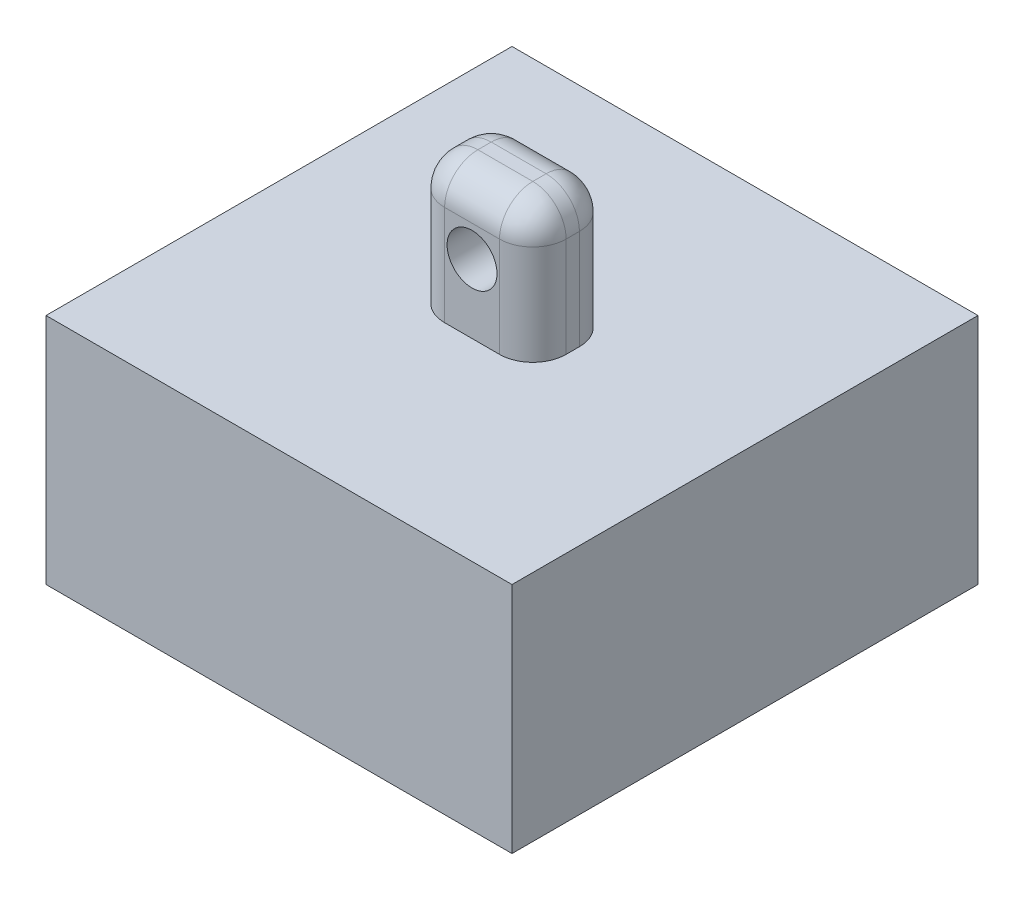
ISO-10303-21;
HEADER;
FILE_DESCRIPTION(('STEP AP214'),'2;1');
FILE_NAME('part.step','',(''),(''),'','','');
FILE_SCHEMA(('AUTOMOTIVE_DESIGN { 1 0 10303 214 1 1 1 1 }'));
ENDSEC;
DATA;
#1=APPLICATION_CONTEXT('core data for automotive mechanical design processes');
#2=APPLICATION_PROTOCOL_DEFINITION('international standard','automotive_design',2000,#1);
#3=PRODUCT_CONTEXT('',#1,'mechanical');
#4=PRODUCT('Part','Part','',(#3));
#5=PRODUCT_RELATED_PRODUCT_CATEGORY('part','',(#4));
#6=PRODUCT_DEFINITION_FORMATION('','',#4);
#7=PRODUCT_DEFINITION_CONTEXT('part definition',#1,'design');
#8=PRODUCT_DEFINITION('design','',#6,#7);
#9=PRODUCT_DEFINITION_SHAPE('','',#8);
#10=(LENGTH_UNIT() NAMED_UNIT(*) SI_UNIT(.MILLI.,.METRE.));
#11=(NAMED_UNIT(*) PLANE_ANGLE_UNIT() SI_UNIT($,.RADIAN.));
#12=(NAMED_UNIT(*) SI_UNIT($,.STERADIAN.) SOLID_ANGLE_UNIT());
#13=UNCERTAINTY_MEASURE_WITH_UNIT(LENGTH_MEASURE(1.E-05),#10,'distance_accuracy_value','');
#14=(GEOMETRIC_REPRESENTATION_CONTEXT(3) GLOBAL_UNCERTAINTY_ASSIGNED_CONTEXT((#13)) GLOBAL_UNIT_ASSIGNED_CONTEXT((#10,
#11,#12)) REPRESENTATION_CONTEXT('',''));
#15=CARTESIAN_POINT('',(0.,0.,0.));
#16=DIRECTION('',(0.,0.,1.));
#17=DIRECTION('',(1.,0.,0.));
#18=AXIS2_PLACEMENT_3D('',#15,#16,#17);
#19=CARTESIAN_POINT('',(0.,0.,0.));
#20=DIRECTION('',(0.,-1.,0.));
#21=DIRECTION('',(0.,0.,-1.));
#22=AXIS2_PLACEMENT_3D('',#19,#20,#21);
#23=PLANE('',#22);
#24=DIRECTION('',(0.,0.,-1.));
#25=VECTOR('',#24,1.);
#26=CARTESIAN_POINT('',(14.,0.,14.));
#27=LINE('',#26,#25);
#28=CARTESIAN_POINT('',(14.,0.,14.));
#29=VERTEX_POINT('',#28);
#30=CARTESIAN_POINT('',(14.,0.,-14.));
#31=VERTEX_POINT('',#30);
#32=EDGE_CURVE('E258',#29,#31,#27,.T.);
#33=ORIENTED_EDGE('',*,*,#32,.F.);
#34=DIRECTION('',(1.,0.,0.));
#35=VECTOR('',#34,1.);
#36=CARTESIAN_POINT('',(-14.,0.,14.));
#37=LINE('',#36,#35);
#38=CARTESIAN_POINT('',(-14.,0.,14.));
#39=VERTEX_POINT('',#38);
#40=EDGE_CURVE('E177',#39,#29,#37,.T.);
#41=ORIENTED_EDGE('',*,*,#40,.F.);
#42=DIRECTION('',(0.,0.,1.));
#43=VECTOR('',#42,1.);
#44=CARTESIAN_POINT('',(-14.,0.,14.));
#45=LINE('',#44,#43);
#46=CARTESIAN_POINT('',(-14.,0.,-14.));
#47=VERTEX_POINT('',#46);
#48=EDGE_CURVE('E264',#47,#39,#45,.T.);
#49=ORIENTED_EDGE('',*,*,#48,.F.);
#50=DIRECTION('',(-1.,0.,0.));
#51=VECTOR('',#50,1.);
#52=CARTESIAN_POINT('',(-14.,0.,-14.));
#53=LINE('',#52,#51);
#54=EDGE_CURVE('E261',#31,#47,#53,.T.);
#55=ORIENTED_EDGE('',*,*,#54,.F.);
#56=EDGE_LOOP('',(#33,#41,#49,#55));
#57=FACE_BOUND('',#56,.T.);
#58=DIRECTION('',(1.,0.,0.));
#59=VECTOR('',#58,1.);
#60=CARTESIAN_POINT('',(-10.5,0.,10.5));
#61=LINE('',#60,#59);
#62=CARTESIAN_POINT('',(-10.5,0.,10.5));
#63=VERTEX_POINT('',#62);
#64=CARTESIAN_POINT('',(10.5,0.,10.5));
#65=VERTEX_POINT('',#64);
#66=EDGE_CURVE('E218',#63,#65,#61,.T.);
#67=ORIENTED_EDGE('',*,*,#66,.T.);
#68=DIRECTION('',(0.,0.,-1.));
#69=VECTOR('',#68,1.);
#70=CARTESIAN_POINT('',(10.5,0.,10.5));
#71=LINE('',#70,#69);
#72=CARTESIAN_POINT('',(10.5,0.,-10.5));
#73=VERTEX_POINT('',#72);
#74=EDGE_CURVE('E212',#65,#73,#71,.T.);
#75=ORIENTED_EDGE('',*,*,#74,.T.);
#76=DIRECTION('',(-1.,0.,0.));
#77=VECTOR('',#76,1.);
#78=CARTESIAN_POINT('',(-10.5,0.,-10.5));
#79=LINE('',#78,#77);
#80=CARTESIAN_POINT('',(-10.5,0.,-10.5));
#81=VERTEX_POINT('',#80);
#82=EDGE_CURVE('E234',#73,#81,#79,.T.);
#83=ORIENTED_EDGE('',*,*,#82,.T.);
#84=DIRECTION('',(0.,0.,1.));
#85=VECTOR('',#84,1.);
#86=CARTESIAN_POINT('',(-10.5,0.,10.5));
#87=LINE('',#86,#85);
#88=EDGE_CURVE('E238',#81,#63,#87,.T.);
#89=ORIENTED_EDGE('',*,*,#88,.T.);
#90=EDGE_LOOP('',(#67,#75,#83,#89));
#91=FACE_BOUND('',#90,.T.);
#92=ADVANCED_FACE('F43',(#57,#91),#23,.T.);
#93=CARTESIAN_POINT('',(14.,11.,14.));
#94=DIRECTION('',(-1.,0.,0.));
#95=DIRECTION('',(0.,0.,1.));
#96=AXIS2_PLACEMENT_3D('',#93,#94,#95);
#97=PLANE('',#96);
#98=ORIENTED_EDGE('',*,*,#32,.T.);
#99=DIRECTION('',(0.,-1.,0.));
#100=VECTOR('',#99,1.);
#101=CARTESIAN_POINT('',(14.,11.,-14.));
#102=LINE('',#101,#100);
#103=CARTESIAN_POINT('',(14.,14.,-14.));
#104=VERTEX_POINT('',#103);
#105=EDGE_CURVE('E188',#104,#31,#102,.T.);
#106=ORIENTED_EDGE('',*,*,#105,.F.);
#107=DIRECTION('',(0.,0.,-1.));
#108=VECTOR('',#107,1.);
#109=CARTESIAN_POINT('',(14.,14.,14.));
#110=LINE('',#109,#108);
#111=CARTESIAN_POINT('',(14.,14.,14.));
#112=VERTEX_POINT('',#111);
#113=EDGE_CURVE('E185',#112,#104,#110,.T.);
#114=ORIENTED_EDGE('',*,*,#113,.F.);
#115=DIRECTION('',(0.,-1.,0.));
#116=VECTOR('',#115,1.);
#117=CARTESIAN_POINT('',(14.,11.,14.));
#118=LINE('',#117,#116);
#119=EDGE_CURVE('E170',#112,#29,#118,.T.);
#120=ORIENTED_EDGE('',*,*,#119,.T.);
#121=EDGE_LOOP('',(#98,#106,#114,#120));
#122=FACE_BOUND('',#121,.T.);
#123=ADVANCED_FACE('F186',(#122),#97,.F.);
#124=CARTESIAN_POINT('',(-14.,11.,-14.));
#125=DIRECTION('',(0.,0.,1.));
#126=DIRECTION('',(1.,0.,0.));
#127=AXIS2_PLACEMENT_3D('',#124,#125,#126);
#128=PLANE('',#127);
#129=ORIENTED_EDGE('',*,*,#54,.T.);
#130=DIRECTION('',(0.,-1.,0.));
#131=VECTOR('',#130,1.);
#132=CARTESIAN_POINT('',(-14.,11.,-14.));
#133=LINE('',#132,#131);
#134=CARTESIAN_POINT('',(-14.,14.,-14.));
#135=VERTEX_POINT('',#134);
#136=EDGE_CURVE('E271',#135,#47,#133,.T.);
#137=ORIENTED_EDGE('',*,*,#136,.F.);
#138=DIRECTION('',(-1.,0.,0.));
#139=VECTOR('',#138,1.);
#140=CARTESIAN_POINT('',(14.,14.,-14.));
#141=LINE('',#140,#139);
#142=EDGE_CURVE('E193',#104,#135,#141,.T.);
#143=ORIENTED_EDGE('',*,*,#142,.F.);
#144=ORIENTED_EDGE('',*,*,#105,.T.);
#145=EDGE_LOOP('',(#129,#137,#143,#144));
#146=FACE_BOUND('',#145,.T.);
#147=ADVANCED_FACE('F466',(#146),#128,.F.);
#148=CARTESIAN_POINT('',(-14.,11.,14.));
#149=DIRECTION('',(1.,0.,0.));
#150=DIRECTION('',(0.,0.,-1.));
#151=AXIS2_PLACEMENT_3D('',#148,#149,#150);
#152=PLANE('',#151);
#153=ORIENTED_EDGE('',*,*,#48,.T.);
#154=DIRECTION('',(0.,-1.,0.));
#155=VECTOR('',#154,1.);
#156=CARTESIAN_POINT('',(-14.,11.,14.));
#157=LINE('',#156,#155);
#158=CARTESIAN_POINT('',(-14.,14.,14.));
#159=VERTEX_POINT('',#158);
#160=EDGE_CURVE('E182',#159,#39,#157,.T.);
#161=ORIENTED_EDGE('',*,*,#160,.F.);
#162=DIRECTION('',(0.,0.,1.));
#163=VECTOR('',#162,1.);
#164=CARTESIAN_POINT('',(-14.,14.,-14.));
#165=LINE('',#164,#163);
#166=EDGE_CURVE('E198',#135,#159,#165,.T.);
#167=ORIENTED_EDGE('',*,*,#166,.F.);
#168=ORIENTED_EDGE('',*,*,#136,.T.);
#169=EDGE_LOOP('',(#153,#161,#167,#168));
#170=FACE_BOUND('',#169,.T.);
#171=ADVANCED_FACE('F475',(#170),#152,.F.);
#172=CARTESIAN_POINT('',(-14.,11.,14.));
#173=DIRECTION('',(0.,0.,-1.));
#174=DIRECTION('',(-1.,0.,0.));
#175=AXIS2_PLACEMENT_3D('',#172,#173,#174);
#176=PLANE('',#175);
#177=ORIENTED_EDGE('',*,*,#40,.T.);
#178=ORIENTED_EDGE('',*,*,#119,.F.);
#179=DIRECTION('',(1.,0.,0.));
#180=VECTOR('',#179,1.);
#181=CARTESIAN_POINT('',(-14.,14.,14.));
#182=LINE('',#181,#180);
#183=EDGE_CURVE('E175',#159,#112,#182,.T.);
#184=ORIENTED_EDGE('',*,*,#183,.F.);
#185=ORIENTED_EDGE('',*,*,#160,.T.);
#186=EDGE_LOOP('',(#177,#178,#184,#185));
#187=FACE_BOUND('',#186,.T.);
#188=ADVANCED_FACE('F172',(#187),#176,.F.);
#189=CARTESIAN_POINT('',(10.5,11.,10.5));
#190=DIRECTION('',(-1.,0.,0.));
#191=DIRECTION('',(0.,0.,1.));
#192=AXIS2_PLACEMENT_3D('',#189,#190,#191);
#193=PLANE('',#192);
#194=ORIENTED_EDGE('',*,*,#74,.F.);
#195=DIRECTION('',(0.,-1.,0.));
#196=VECTOR('',#195,1.);
#197=CARTESIAN_POINT('',(10.5,11.,10.5));
#198=LINE('',#197,#196);
#199=CARTESIAN_POINT('',(10.5,11.,10.5));
#200=VERTEX_POINT('',#199);
#201=EDGE_CURVE('E230',#200,#65,#198,.T.);
#202=ORIENTED_EDGE('',*,*,#201,.F.);
#203=DIRECTION('',(0.,0.,-1.));
#204=VECTOR('',#203,1.);
#205=CARTESIAN_POINT('',(10.5,11.,10.5));
#206=LINE('',#205,#204);
#207=CARTESIAN_POINT('',(10.5,11.,-10.5));
#208=VERTEX_POINT('',#207);
#209=EDGE_CURVE('E213',#200,#208,#206,.T.);
#210=ORIENTED_EDGE('',*,*,#209,.T.);
#211=DIRECTION('',(0.,-1.,0.));
#212=VECTOR('',#211,1.);
#213=CARTESIAN_POINT('',(10.5,11.,-10.5));
#214=LINE('',#213,#212);
#215=EDGE_CURVE('E254',#208,#73,#214,.T.);
#216=ORIENTED_EDGE('',*,*,#215,.T.);
#217=EDGE_LOOP('',(#194,#202,#210,#216));
#218=FACE_BOUND('',#217,.T.);
#219=ADVANCED_FACE('F471',(#218),#193,.T.);
#220=CARTESIAN_POINT('',(-10.5,11.,-10.5));
#221=DIRECTION('',(0.,0.,1.));
#222=DIRECTION('',(1.,0.,0.));
#223=AXIS2_PLACEMENT_3D('',#220,#221,#222);
#224=PLANE('',#223);
#225=ORIENTED_EDGE('',*,*,#82,.F.);
#226=ORIENTED_EDGE('',*,*,#215,.F.);
#227=DIRECTION('',(-1.,0.,0.));
#228=VECTOR('',#227,1.);
#229=CARTESIAN_POINT('',(-10.5,11.,-10.5));
#230=LINE('',#229,#228);
#231=CARTESIAN_POINT('',(-10.5,11.,-10.5));
#232=VERTEX_POINT('',#231);
#233=EDGE_CURVE('E217',#208,#232,#230,.T.);
#234=ORIENTED_EDGE('',*,*,#233,.T.);
#235=DIRECTION('',(0.,-1.,0.));
#236=VECTOR('',#235,1.);
#237=CARTESIAN_POINT('',(-10.5,11.,-10.5));
#238=LINE('',#237,#236);
#239=EDGE_CURVE('E251',#232,#81,#238,.T.);
#240=ORIENTED_EDGE('',*,*,#239,.T.);
#241=EDGE_LOOP('',(#225,#226,#234,#240));
#242=FACE_BOUND('',#241,.T.);
#243=ADVANCED_FACE('F500',(#242),#224,.T.);
#244=CARTESIAN_POINT('',(-10.5,11.,10.5));
#245=DIRECTION('',(1.,0.,0.));
#246=DIRECTION('',(0.,0.,-1.));
#247=AXIS2_PLACEMENT_3D('',#244,#245,#246);
#248=PLANE('',#247);
#249=ORIENTED_EDGE('',*,*,#88,.F.);
#250=ORIENTED_EDGE('',*,*,#239,.F.);
#251=DIRECTION('',(0.,0.,1.));
#252=VECTOR('',#251,1.);
#253=CARTESIAN_POINT('',(-10.5,11.,10.5));
#254=LINE('',#253,#252);
#255=CARTESIAN_POINT('',(-10.5,11.,10.5));
#256=VERTEX_POINT('',#255);
#257=EDGE_CURVE('E222',#232,#256,#254,.T.);
#258=ORIENTED_EDGE('',*,*,#257,.T.);
#259=DIRECTION('',(0.,-1.,0.));
#260=VECTOR('',#259,1.);
#261=CARTESIAN_POINT('',(-10.5,11.,10.5));
#262=LINE('',#261,#260);
#263=EDGE_CURVE('E248',#256,#63,#262,.T.);
#264=ORIENTED_EDGE('',*,*,#263,.T.);
#265=EDGE_LOOP('',(#249,#250,#258,#264));
#266=FACE_BOUND('',#265,.T.);
#267=ADVANCED_FACE('F507',(#266),#248,.T.);
#268=CARTESIAN_POINT('',(-10.5,11.,10.5));
#269=DIRECTION('',(0.,0.,-1.));
#270=DIRECTION('',(-1.,0.,0.));
#271=AXIS2_PLACEMENT_3D('',#268,#269,#270);
#272=PLANE('',#271);
#273=ORIENTED_EDGE('',*,*,#66,.F.);
#274=ORIENTED_EDGE('',*,*,#263,.F.);
#275=DIRECTION('',(1.,0.,0.));
#276=VECTOR('',#275,1.);
#277=CARTESIAN_POINT('',(-10.5,11.,10.5));
#278=LINE('',#277,#276);
#279=EDGE_CURVE('E226',#256,#200,#278,.T.);
#280=ORIENTED_EDGE('',*,*,#279,.T.);
#281=ORIENTED_EDGE('',*,*,#201,.T.);
#282=EDGE_LOOP('',(#273,#274,#280,#281));
#283=FACE_BOUND('',#282,.T.);
#284=ADVANCED_FACE('F514',(#283),#272,.T.);
#285=CARTESIAN_POINT('',(0.,11.,0.));
#286=DIRECTION('',(0.,1.,0.));
#287=DIRECTION('',(0.,0.,1.));
#288=AXIS2_PLACEMENT_3D('',#285,#286,#287);
#289=PLANE('',#288);
#290=ORIENTED_EDGE('',*,*,#209,.F.);
#291=ORIENTED_EDGE('',*,*,#279,.F.);
#292=ORIENTED_EDGE('',*,*,#257,.F.);
#293=ORIENTED_EDGE('',*,*,#233,.F.);
#294=EDGE_LOOP('',(#290,#291,#292,#293));
#295=FACE_BOUND('',#294,.T.);
#296=ADVANCED_FACE('F522',(#295),#289,.F.);
#297=CARTESIAN_POINT('',(0.,14.,0.));
#298=DIRECTION('',(0.,1.,0.));
#299=DIRECTION('',(0.,0.,1.));
#300=AXIS2_PLACEMENT_3D('',#297,#298,#299);
#301=PLANE('',#300);
#302=DIRECTION('',(0.,0.,1.));
#303=VECTOR('',#302,1.);
#304=CARTESIAN_POINT('',(-3.65,14.,2.4));
#305=LINE('',#304,#303);
#306=CARTESIAN_POINT('',(-3.65,14.,-0.4));
#307=VERTEX_POINT('',#306);
#308=CARTESIAN_POINT('',(-3.65,14.,0.399999999999999));
#309=VERTEX_POINT('',#308);
#310=EDGE_CURVE('E381',#307,#309,#305,.T.);
#311=ORIENTED_EDGE('',*,*,#310,.F.);
#312=CARTESIAN_POINT('',(-1.65,14.,-0.4));
#313=DIRECTION('',(0.,1.,0.));
#314=DIRECTION('',(0.,0.,1.));
#315=AXIS2_PLACEMENT_3D('',#312,#313,#314);
#316=CIRCLE('',#315,2.);
#317=CARTESIAN_POINT('',(-1.65,14.,-2.4));
#318=VERTEX_POINT('',#317);
#319=EDGE_CURVE('E328',#307,#318,#316,.F.);
#320=ORIENTED_EDGE('',*,*,#319,.T.);
#321=DIRECTION('',(-1.,0.,0.));
#322=VECTOR('',#321,1.);
#323=CARTESIAN_POINT('',(3.65,14.,-2.4));
#324=LINE('',#323,#322);
#325=CARTESIAN_POINT('',(1.65,14.,-2.4));
#326=VERTEX_POINT('',#325);
#327=EDGE_CURVE('E200',#326,#318,#324,.T.);
#328=ORIENTED_EDGE('',*,*,#327,.F.);
#329=CARTESIAN_POINT('',(1.65,14.,-0.4));
#330=DIRECTION('',(0.,1.,0.));
#331=DIRECTION('',(0.,0.,1.));
#332=AXIS2_PLACEMENT_3D('',#329,#330,#331);
#333=CIRCLE('',#332,2.);
#334=CARTESIAN_POINT('',(3.65,14.,-0.4));
#335=VERTEX_POINT('',#334);
#336=EDGE_CURVE('E11',#326,#335,#333,.F.);
#337=ORIENTED_EDGE('',*,*,#336,.T.);
#338=DIRECTION('',(0.,0.,-1.));
#339=VECTOR('',#338,1.);
#340=CARTESIAN_POINT('',(3.65,14.,2.4));
#341=LINE('',#340,#339);
#342=CARTESIAN_POINT('',(3.65,14.,0.399999999999999));
#343=VERTEX_POINT('',#342);
#344=EDGE_CURVE('E204',#343,#335,#341,.T.);
#345=ORIENTED_EDGE('',*,*,#344,.F.);
#346=CARTESIAN_POINT('',(1.65,14.,0.399999999999999));
#347=DIRECTION('',(0.,1.,0.));
#348=DIRECTION('',(0.,0.,1.));
#349=AXIS2_PLACEMENT_3D('',#346,#347,#348);
#350=CIRCLE('',#349,2.);
#351=CARTESIAN_POINT('',(1.65,14.,2.4));
#352=VERTEX_POINT('',#351);
#353=EDGE_CURVE('E53',#343,#352,#350,.F.);
#354=ORIENTED_EDGE('',*,*,#353,.T.);
#355=DIRECTION('',(1.,0.,0.));
#356=VECTOR('',#355,1.);
#357=CARTESIAN_POINT('',(3.65,14.,2.4));
#358=LINE('',#357,#356);
#359=CARTESIAN_POINT('',(-1.65,14.,2.4));
#360=VERTEX_POINT('',#359);
#361=EDGE_CURVE('E386',#360,#352,#358,.T.);
#362=ORIENTED_EDGE('',*,*,#361,.F.);
#363=CARTESIAN_POINT('',(-1.65,14.,0.4));
#364=DIRECTION('',(0.,1.,0.));
#365=DIRECTION('',(0.,0.,1.));
#366=AXIS2_PLACEMENT_3D('',#363,#364,#365);
#367=CIRCLE('',#366,2.);
#368=EDGE_CURVE('E325',#360,#309,#367,.F.);
#369=ORIENTED_EDGE('',*,*,#368,.T.);
#370=EDGE_LOOP('',(#311,#320,#328,#337,#345,#354,#362,#369));
#371=FACE_BOUND('',#370,.T.);
#372=ORIENTED_EDGE('',*,*,#183,.T.);
#373=ORIENTED_EDGE('',*,*,#113,.T.);
#374=ORIENTED_EDGE('',*,*,#142,.T.);
#375=ORIENTED_EDGE('',*,*,#166,.T.);
#376=EDGE_LOOP('',(#372,#373,#374,#375));
#377=FACE_BOUND('',#376,.T.);
#378=ADVANCED_FACE('F196',(#371,#377),#301,.T.);
#379=CARTESIAN_POINT('',(-3.65,22.,2.4));
#380=DIRECTION('',(1.,0.,0.));
#381=DIRECTION('',(0.,0.,-1.));
#382=AXIS2_PLACEMENT_3D('',#379,#380,#381);
#383=PLANE('',#382);
#384=ORIENTED_EDGE('',*,*,#310,.T.);
#385=DIRECTION('',(0.,-1.,0.));
#386=VECTOR('',#385,1.);
#387=CARTESIAN_POINT('',(-3.65,22.,0.399999999999999));
#388=LINE('',#387,#386);
#389=CARTESIAN_POINT('',(-3.65,20.,0.399999999999999));
#390=VERTEX_POINT('',#389);
#391=EDGE_CURVE('E293',#309,#390,#388,.F.);
#392=ORIENTED_EDGE('',*,*,#391,.T.);
#393=DIRECTION('',(0.,0.,1.));
#394=VECTOR('',#393,1.);
#395=CARTESIAN_POINT('',(-3.65,20.,-2.4));
#396=LINE('',#395,#394);
#397=CARTESIAN_POINT('',(-3.65,20.,-0.4));
#398=VERTEX_POINT('',#397);
#399=EDGE_CURVE('E287',#390,#398,#396,.F.);
#400=ORIENTED_EDGE('',*,*,#399,.T.);
#401=DIRECTION('',(0.,-1.,0.));
#402=VECTOR('',#401,1.);
#403=CARTESIAN_POINT('',(-3.65,22.,-0.4));
#404=LINE('',#403,#402);
#405=EDGE_CURVE('E290',#398,#307,#404,.T.);
#406=ORIENTED_EDGE('',*,*,#405,.T.);
#407=EDGE_LOOP('',(#384,#392,#400,#406));
#408=FACE_BOUND('',#407,.T.);
#409=ADVANCED_FACE('F537',(#408),#383,.F.);
#410=CARTESIAN_POINT('',(3.65,22.,2.4));
#411=DIRECTION('',(0.,0.,-1.));
#412=DIRECTION('',(-1.,0.,0.));
#413=AXIS2_PLACEMENT_3D('',#410,#411,#412);
#414=PLANE('',#413);
#415=CARTESIAN_POINT('',(0.,18.1285772913535,2.4));
#416=DIRECTION('',(0.,0.,-1.));
#417=DIRECTION('',(-1.,0.,0.));
#418=AXIS2_PLACEMENT_3D('',#415,#416,#417);
#419=CIRCLE('',#418,1.5);
#420=CARTESIAN_POINT('',(-1.5,18.1285772913535,2.4));
#421=VERTEX_POINT('',#420);
#422=EDGE_CURVE('E338',#421,#421,#419,.T.);
#423=ORIENTED_EDGE('',*,*,#422,.T.);
#424=EDGE_LOOP('',(#423));
#425=FACE_BOUND('',#424,.T.);
#426=DIRECTION('',(1.,0.,0.));
#427=VECTOR('',#426,1.);
#428=CARTESIAN_POINT('',(-3.65,20.,2.4));
#429=LINE('',#428,#427);
#430=CARTESIAN_POINT('',(1.65,20.,2.4));
#431=VERTEX_POINT('',#430);
#432=CARTESIAN_POINT('',(-1.65,20.,2.4));
#433=VERTEX_POINT('',#432);
#434=EDGE_CURVE('E280',#431,#433,#429,.F.);
#435=ORIENTED_EDGE('',*,*,#434,.T.);
#436=DIRECTION('',(0.,-1.,0.));
#437=VECTOR('',#436,1.);
#438=CARTESIAN_POINT('',(-1.65,22.,2.4));
#439=LINE('',#438,#437);
#440=EDGE_CURVE('E283',#433,#360,#439,.T.);
#441=ORIENTED_EDGE('',*,*,#440,.T.);
#442=ORIENTED_EDGE('',*,*,#361,.T.);
#443=DIRECTION('',(0.,-1.,0.));
#444=VECTOR('',#443,1.);
#445=CARTESIAN_POINT('',(1.65,22.,2.4));
#446=LINE('',#445,#444);
#447=EDGE_CURVE('E277',#352,#431,#446,.F.);
#448=ORIENTED_EDGE('',*,*,#447,.T.);
#449=EDGE_LOOP('',(#435,#441,#442,#448));
#450=FACE_BOUND('',#449,.T.);
#451=ADVANCED_FACE('F419',(#425,#450),#414,.F.);
#452=CARTESIAN_POINT('',(3.65,22.,2.4));
#453=DIRECTION('',(-1.,0.,0.));
#454=DIRECTION('',(0.,0.,1.));
#455=AXIS2_PLACEMENT_3D('',#452,#453,#454);
#456=PLANE('',#455);
#457=DIRECTION('',(0.,0.,-1.));
#458=VECTOR('',#457,1.);
#459=CARTESIAN_POINT('',(3.65,20.,2.4));
#460=LINE('',#459,#458);
#461=CARTESIAN_POINT('',(3.65,20.,-0.4));
#462=VERTEX_POINT('',#461);
#463=CARTESIAN_POINT('',(3.65,20.,0.399999999999999));
#464=VERTEX_POINT('',#463);
#465=EDGE_CURVE('E61',#462,#464,#460,.F.);
#466=ORIENTED_EDGE('',*,*,#465,.T.);
#467=DIRECTION('',(0.,-1.,0.));
#468=VECTOR('',#467,1.);
#469=CARTESIAN_POINT('',(3.65,22.,0.399999999999999));
#470=LINE('',#469,#468);
#471=EDGE_CURVE('E322',#464,#343,#470,.T.);
#472=ORIENTED_EDGE('',*,*,#471,.T.);
#473=ORIENTED_EDGE('',*,*,#344,.T.);
#474=DIRECTION('',(0.,-1.,0.));
#475=VECTOR('',#474,1.);
#476=CARTESIAN_POINT('',(3.65,22.,-0.4));
#477=LINE('',#476,#475);
#478=EDGE_CURVE('E66',#335,#462,#477,.F.);
#479=ORIENTED_EDGE('',*,*,#478,.T.);
#480=EDGE_LOOP('',(#466,#472,#473,#479));
#481=FACE_BOUND('',#480,.T.);
#482=ADVANCED_FACE('F398',(#481),#456,.F.);
#483=CARTESIAN_POINT('',(3.65,22.,-2.4));
#484=DIRECTION('',(0.,0.,1.));
#485=DIRECTION('',(1.,0.,0.));
#486=AXIS2_PLACEMENT_3D('',#483,#484,#485);
#487=PLANE('',#486);
#488=CARTESIAN_POINT('',(0.,18.1285772913535,-2.4));
#489=DIRECTION('',(0.,0.,-1.));
#490=DIRECTION('',(-1.,0.,0.));
#491=AXIS2_PLACEMENT_3D('',#488,#489,#490);
#492=CIRCLE('',#491,1.5);
#493=CARTESIAN_POINT('',(-1.5,18.1285772913535,-2.4));
#494=VERTEX_POINT('',#493);
#495=EDGE_CURVE('E776',#494,#494,#492,.T.);
#496=ORIENTED_EDGE('',*,*,#495,.F.);
#497=EDGE_LOOP('',(#496));
#498=FACE_BOUND('',#497,.T.);
#499=ORIENTED_EDGE('',*,*,#327,.T.);
#500=DIRECTION('',(0.,-1.,0.));
#501=VECTOR('',#500,1.);
#502=CARTESIAN_POINT('',(-1.65,22.,-2.4));
#503=LINE('',#502,#501);
#504=CARTESIAN_POINT('',(-1.65,20.,-2.4));
#505=VERTEX_POINT('',#504);
#506=EDGE_CURVE('E302',#318,#505,#503,.F.);
#507=ORIENTED_EDGE('',*,*,#506,.T.);
#508=DIRECTION('',(-1.,0.,0.));
#509=VECTOR('',#508,1.);
#510=CARTESIAN_POINT('',(3.65,20.,-2.4));
#511=LINE('',#510,#509);
#512=CARTESIAN_POINT('',(1.65,20.,-2.4));
#513=VERTEX_POINT('',#512);
#514=EDGE_CURVE('E299',#505,#513,#511,.F.);
#515=ORIENTED_EDGE('',*,*,#514,.T.);
#516=DIRECTION('',(0.,-1.,0.));
#517=VECTOR('',#516,1.);
#518=CARTESIAN_POINT('',(1.65,22.,-2.4));
#519=LINE('',#518,#517);
#520=EDGE_CURVE('E296',#513,#326,#519,.T.);
#521=ORIENTED_EDGE('',*,*,#520,.T.);
#522=EDGE_LOOP('',(#499,#507,#515,#521));
#523=FACE_BOUND('',#522,.T.);
#524=ADVANCED_FACE('F433',(#498,#523),#487,.F.);
#525=CARTESIAN_POINT('',(0.,22.,0.));
#526=DIRECTION('',(0.,1.,0.));
#527=DIRECTION('',(0.,0.,1.));
#528=AXIS2_PLACEMENT_3D('',#525,#526,#527);
#529=PLANE('',#528);
#530=DIRECTION('',(-1.,0.,0.));
#531=VECTOR('',#530,1.);
#532=CARTESIAN_POINT('',(-3.65,22.,-0.399999999999999));
#533=LINE('',#532,#531);
#534=CARTESIAN_POINT('',(1.65,22.,-0.4));
#535=VERTEX_POINT('',#534);
#536=CARTESIAN_POINT('',(-1.65,22.,-0.4));
#537=VERTEX_POINT('',#536);
#538=EDGE_CURVE('E311',#535,#537,#533,.T.);
#539=ORIENTED_EDGE('',*,*,#538,.T.);
#540=DIRECTION('',(0.,0.,1.));
#541=VECTOR('',#540,1.);
#542=CARTESIAN_POINT('',(-1.65,22.,2.4));
#543=LINE('',#542,#541);
#544=CARTESIAN_POINT('',(-1.65,22.,0.4));
#545=VERTEX_POINT('',#544);
#546=EDGE_CURVE('E314',#537,#545,#543,.T.);
#547=ORIENTED_EDGE('',*,*,#546,.T.);
#548=DIRECTION('',(1.,0.,0.));
#549=VECTOR('',#548,1.);
#550=CARTESIAN_POINT('',(3.65,22.,0.399999999999999));
#551=LINE('',#550,#549);
#552=CARTESIAN_POINT('',(1.65,22.,0.399999999999999));
#553=VERTEX_POINT('',#552);
#554=EDGE_CURVE('E308',#545,#553,#551,.T.);
#555=ORIENTED_EDGE('',*,*,#554,.T.);
#556=DIRECTION('',(0.,0.,-1.));
#557=VECTOR('',#556,1.);
#558=CARTESIAN_POINT('',(1.65,22.,-2.4));
#559=LINE('',#558,#557);
#560=EDGE_CURVE('E305',#553,#535,#559,.T.);
#561=ORIENTED_EDGE('',*,*,#560,.T.);
#562=EDGE_LOOP('',(#539,#547,#555,#561));
#563=FACE_BOUND('',#562,.T.);
#564=ADVANCED_FACE('F446',(#563),#529,.T.);
#565=CARTESIAN_POINT('',(1.65,22.,-0.4));
#566=DIRECTION('',(0.,-1.,0.));
#567=DIRECTION('',(0.,0.,-1.));
#568=AXIS2_PLACEMENT_3D('',#565,#566,#567);
#569=CYLINDRICAL_SURFACE('',#568,2.);
#570=CARTESIAN_POINT('',(1.65,20.,-0.4));
#571=DIRECTION('',(0.,1.,0.));
#572=DIRECTION('',(0.,0.,1.));
#573=AXIS2_PLACEMENT_3D('',#570,#571,#572);
#574=CIRCLE('',#573,2.);
#575=EDGE_CURVE('E47',#462,#513,#574,.T.);
#576=ORIENTED_EDGE('',*,*,#575,.F.);
#577=ORIENTED_EDGE('',*,*,#478,.F.);
#578=ORIENTED_EDGE('',*,*,#336,.F.);
#579=ORIENTED_EDGE('',*,*,#520,.F.);
#580=EDGE_LOOP('',(#576,#577,#578,#579));
#581=FACE_BOUND('',#580,.T.);
#582=ADVANCED_FACE('F45',(#581),#569,.T.);
#583=CARTESIAN_POINT('',(1.65,20.,-0.4));
#584=DIRECTION('',(0.,0.,-1.));
#585=DIRECTION('',(-1.,0.,0.));
#586=AXIS2_PLACEMENT_3D('',#583,#584,#585);
#587=SPHERICAL_SURFACE('',#586,2.);
#588=CARTESIAN_POINT('',(1.65,20.,-0.4));
#589=DIRECTION('',(0.,0.,-1.));
#590=DIRECTION('',(-1.,0.,0.));
#591=AXIS2_PLACEMENT_3D('',#588,#589,#590);
#592=CIRCLE('',#591,2.);
#593=EDGE_CURVE('E369',#462,#535,#592,.F.);
#594=ORIENTED_EDGE('',*,*,#593,.F.);
#595=ORIENTED_EDGE('',*,*,#575,.T.);
#596=CARTESIAN_POINT('',(1.65,20.,-0.4));
#597=DIRECTION('',(1.,0.,0.));
#598=DIRECTION('',(0.,0.,-1.));
#599=AXIS2_PLACEMENT_3D('',#596,#597,#598);
#600=CIRCLE('',#599,2.);
#601=EDGE_CURVE('E372',#535,#513,#600,.F.);
#602=ORIENTED_EDGE('',*,*,#601,.F.);
#603=EDGE_LOOP('',(#594,#595,#602));
#604=FACE_BOUND('',#603,.T.);
#605=ADVANCED_FACE('F404',(#604),#587,.T.);
#606=CARTESIAN_POINT('',(-1.65,22.,-0.4));
#607=DIRECTION('',(0.,-1.,0.));
#608=DIRECTION('',(0.,0.,-1.));
#609=AXIS2_PLACEMENT_3D('',#606,#607,#608);
#610=CYLINDRICAL_SURFACE('',#609,2.);
#611=ORIENTED_EDGE('',*,*,#319,.F.);
#612=ORIENTED_EDGE('',*,*,#405,.F.);
#613=CARTESIAN_POINT('',(-1.65,20.,-0.4));
#614=DIRECTION('',(0.,1.,0.));
#615=DIRECTION('',(0.,0.,1.));
#616=AXIS2_PLACEMENT_3D('',#613,#614,#615);
#617=CIRCLE('',#616,2.);
#618=EDGE_CURVE('E365',#505,#398,#617,.T.);
#619=ORIENTED_EDGE('',*,*,#618,.F.);
#620=ORIENTED_EDGE('',*,*,#506,.F.);
#621=EDGE_LOOP('',(#611,#612,#619,#620));
#622=FACE_BOUND('',#621,.T.);
#623=ADVANCED_FACE('F430',(#622),#610,.T.);
#624=CARTESIAN_POINT('',(0.,20.,-0.4));
#625=DIRECTION('',(1.,0.,0.));
#626=DIRECTION('',(0.,0.,-1.));
#627=AXIS2_PLACEMENT_3D('',#624,#625,#626);
#628=CYLINDRICAL_SURFACE('',#627,2.);
#629=ORIENTED_EDGE('',*,*,#601,.T.);
#630=ORIENTED_EDGE('',*,*,#514,.F.);
#631=CARTESIAN_POINT('',(-1.65,20.,-0.4));
#632=DIRECTION('',(-1.,0.,0.));
#633=DIRECTION('',(0.,0.,1.));
#634=AXIS2_PLACEMENT_3D('',#631,#632,#633);
#635=CIRCLE('',#634,2.);
#636=EDGE_CURVE('E361',#537,#505,#635,.T.);
#637=ORIENTED_EDGE('',*,*,#636,.F.);
#638=ORIENTED_EDGE('',*,*,#538,.F.);
#639=EDGE_LOOP('',(#629,#630,#637,#638));
#640=FACE_BOUND('',#639,.T.);
#641=ADVANCED_FACE('F435',(#640),#628,.T.);
#642=CARTESIAN_POINT('',(1.65,20.,0.));
#643=DIRECTION('',(0.,0.,1.));
#644=DIRECTION('',(1.,0.,0.));
#645=AXIS2_PLACEMENT_3D('',#642,#643,#644);
#646=CYLINDRICAL_SURFACE('',#645,2.);
#647=ORIENTED_EDGE('',*,*,#593,.T.);
#648=ORIENTED_EDGE('',*,*,#560,.F.);
#649=CARTESIAN_POINT('',(1.65,20.,0.399999999999999));
#650=DIRECTION('',(0.,0.,1.));
#651=DIRECTION('',(0.,-1.,0.));
#652=AXIS2_PLACEMENT_3D('',#649,#650,#651);
#653=CIRCLE('',#652,2.);
#654=EDGE_CURVE('E357',#464,#553,#653,.T.);
#655=ORIENTED_EDGE('',*,*,#654,.F.);
#656=ORIENTED_EDGE('',*,*,#465,.F.);
#657=EDGE_LOOP('',(#647,#648,#655,#656));
#658=FACE_BOUND('',#657,.T.);
#659=ADVANCED_FACE('F408',(#658),#646,.T.);
#660=CARTESIAN_POINT('',(1.65,22.,0.399999999999999));
#661=DIRECTION('',(0.,-1.,0.));
#662=DIRECTION('',(0.,0.,-1.));
#663=AXIS2_PLACEMENT_3D('',#660,#661,#662);
#664=CYLINDRICAL_SURFACE('',#663,2.);
#665=ORIENTED_EDGE('',*,*,#353,.F.);
#666=ORIENTED_EDGE('',*,*,#471,.F.);
#667=CARTESIAN_POINT('',(1.65,20.,0.399999999999999));
#668=DIRECTION('',(0.,1.,0.));
#669=DIRECTION('',(0.,0.,1.));
#670=AXIS2_PLACEMENT_3D('',#667,#668,#669);
#671=CIRCLE('',#670,2.);
#672=EDGE_CURVE('E353',#431,#464,#671,.T.);
#673=ORIENTED_EDGE('',*,*,#672,.F.);
#674=ORIENTED_EDGE('',*,*,#447,.F.);
#675=EDGE_LOOP('',(#665,#666,#673,#674));
#676=FACE_BOUND('',#675,.T.);
#677=ADVANCED_FACE('F416',(#676),#664,.T.);
#678=CARTESIAN_POINT('',(-1.65,20.,-0.4));
#679=DIRECTION('',(0.,0.,-1.));
#680=DIRECTION('',(-1.,0.,0.));
#681=AXIS2_PLACEMENT_3D('',#678,#679,#680);
#682=SPHERICAL_SURFACE('',#681,2.);
#683=ORIENTED_EDGE('',*,*,#636,.T.);
#684=ORIENTED_EDGE('',*,*,#618,.T.);
#685=CARTESIAN_POINT('',(-1.65,20.,-0.4));
#686=DIRECTION('',(0.,0.,-1.));
#687=DIRECTION('',(-1.,0.,0.));
#688=AXIS2_PLACEMENT_3D('',#685,#686,#687);
#689=CIRCLE('',#688,2.);
#690=EDGE_CURVE('E349',#537,#398,#689,.F.);
#691=ORIENTED_EDGE('',*,*,#690,.F.);
#692=EDGE_LOOP('',(#683,#684,#691));
#693=FACE_BOUND('',#692,.T.);
#694=ADVANCED_FACE('F439',(#693),#682,.T.);
#695=CARTESIAN_POINT('',(1.65,20.,0.399999999999999));
#696=DIRECTION('',(1.,0.,0.));
#697=DIRECTION('',(0.,0.,-1.));
#698=AXIS2_PLACEMENT_3D('',#695,#696,#697);
#699=SPHERICAL_SURFACE('',#698,2.);
#700=ORIENTED_EDGE('',*,*,#672,.T.);
#701=ORIENTED_EDGE('',*,*,#654,.T.);
#702=CARTESIAN_POINT('',(1.65,20.,0.399999999999999));
#703=DIRECTION('',(1.,0.,0.));
#704=DIRECTION('',(0.,0.,-1.));
#705=AXIS2_PLACEMENT_3D('',#702,#703,#704);
#706=CIRCLE('',#705,2.);
#707=EDGE_CURVE('E345',#431,#553,#706,.F.);
#708=ORIENTED_EDGE('',*,*,#707,.F.);
#709=EDGE_LOOP('',(#700,#701,#708));
#710=FACE_BOUND('',#709,.T.);
#711=ADVANCED_FACE('F412',(#710),#699,.T.);
#712=CARTESIAN_POINT('',(-1.65,20.,0.));
#713=DIRECTION('',(0.,0.,-1.));
#714=DIRECTION('',(-1.,0.,0.));
#715=AXIS2_PLACEMENT_3D('',#712,#713,#714);
#716=CYLINDRICAL_SURFACE('',#715,2.);
#717=ORIENTED_EDGE('',*,*,#690,.T.);
#718=ORIENTED_EDGE('',*,*,#399,.F.);
#719=CARTESIAN_POINT('',(-1.65,20.,0.4));
#720=DIRECTION('',(0.,0.,1.));
#721=DIRECTION('',(1.,0.,0.));
#722=AXIS2_PLACEMENT_3D('',#719,#720,#721);
#723=CIRCLE('',#722,2.);
#724=EDGE_CURVE('E341',#545,#390,#723,.T.);
#725=ORIENTED_EDGE('',*,*,#724,.F.);
#726=ORIENTED_EDGE('',*,*,#546,.F.);
#727=EDGE_LOOP('',(#717,#718,#725,#726));
#728=FACE_BOUND('',#727,.T.);
#729=ADVANCED_FACE('F443',(#728),#716,.T.);
#730=CARTESIAN_POINT('',(0.,20.,0.399999999999999));
#731=DIRECTION('',(-1.,0.,0.));
#732=DIRECTION('',(0.,0.,1.));
#733=AXIS2_PLACEMENT_3D('',#730,#731,#732);
#734=CYLINDRICAL_SURFACE('',#733,2.);
#735=ORIENTED_EDGE('',*,*,#707,.T.);
#736=ORIENTED_EDGE('',*,*,#554,.F.);
#737=CARTESIAN_POINT('',(-1.65,20.,0.399999999999999));
#738=DIRECTION('',(-1.,0.,0.));
#739=DIRECTION('',(0.,-1.,0.));
#740=AXIS2_PLACEMENT_3D('',#737,#738,#739);
#741=CIRCLE('',#740,2.);
#742=EDGE_CURVE('E337',#433,#545,#741,.T.);
#743=ORIENTED_EDGE('',*,*,#742,.F.);
#744=ORIENTED_EDGE('',*,*,#434,.F.);
#745=EDGE_LOOP('',(#735,#736,#743,#744));
#746=FACE_BOUND('',#745,.T.);
#747=ADVANCED_FACE('F448',(#746),#734,.T.);
#748=CARTESIAN_POINT('',(-1.65,20.,0.4));
#749=DIRECTION('',(0.,1.,0.));
#750=DIRECTION('',(0.,0.,1.));
#751=AXIS2_PLACEMENT_3D('',#748,#749,#750);
#752=SPHERICAL_SURFACE('',#751,2.);
#753=ORIENTED_EDGE('',*,*,#742,.T.);
#754=ORIENTED_EDGE('',*,*,#724,.T.);
#755=CARTESIAN_POINT('',(-1.65,20.,0.4));
#756=DIRECTION('',(0.,1.,0.));
#757=DIRECTION('',(0.,0.,1.));
#758=AXIS2_PLACEMENT_3D('',#755,#756,#757);
#759=CIRCLE('',#758,2.);
#760=EDGE_CURVE('E333',#433,#390,#759,.F.);
#761=ORIENTED_EDGE('',*,*,#760,.F.);
#762=EDGE_LOOP('',(#753,#754,#761));
#763=FACE_BOUND('',#762,.T.);
#764=ADVANCED_FACE('F450',(#763),#752,.T.);
#765=CARTESIAN_POINT('',(-1.65,22.,0.4));
#766=DIRECTION('',(0.,-1.,0.));
#767=DIRECTION('',(0.,0.,-1.));
#768=AXIS2_PLACEMENT_3D('',#765,#766,#767);
#769=CYLINDRICAL_SURFACE('',#768,2.);
#770=ORIENTED_EDGE('',*,*,#760,.T.);
#771=ORIENTED_EDGE('',*,*,#391,.F.);
#772=ORIENTED_EDGE('',*,*,#368,.F.);
#773=ORIENTED_EDGE('',*,*,#440,.F.);
#774=EDGE_LOOP('',(#770,#771,#772,#773));
#775=FACE_BOUND('',#774,.T.);
#776=ADVANCED_FACE('F423',(#775),#769,.T.);
#777=CARTESIAN_POINT('',(0.,18.1285772913535,2.6));
#778=DIRECTION('',(0.,0.,-1.));
#779=DIRECTION('',(-1.,0.,0.));
#780=AXIS2_PLACEMENT_3D('',#777,#778,#779);
#781=CYLINDRICAL_SURFACE('',#780,1.5);
#782=ORIENTED_EDGE('',*,*,#495,.T.);
#783=EDGE_LOOP('',(#782));
#784=FACE_BOUND('',#783,.T.);
#785=ORIENTED_EDGE('',*,*,#422,.F.);
#786=EDGE_LOOP('',(#785));
#787=FACE_BOUND('',#786,.T.);
#788=ADVANCED_FACE('F457',(#784,#787),#781,.F.);
#789=CLOSED_SHELL('',(#92,#123,#147,#171,#188,#219,#243,#267,#284,#296,#378,#409,#451,#482,#524,
#564,#582,#605,#623,#641,#659,#677,#694,#711,#729,#747,#764,#776,#788));
#790=MANIFOLD_SOLID_BREP('B2',#789);
#791=ADVANCED_BREP_SHAPE_REPRESENTATION('',(#18,#790),#14);
#792=SHAPE_DEFINITION_REPRESENTATION(#9,#791);
ENDSEC;
END-ISO-10303-21;
